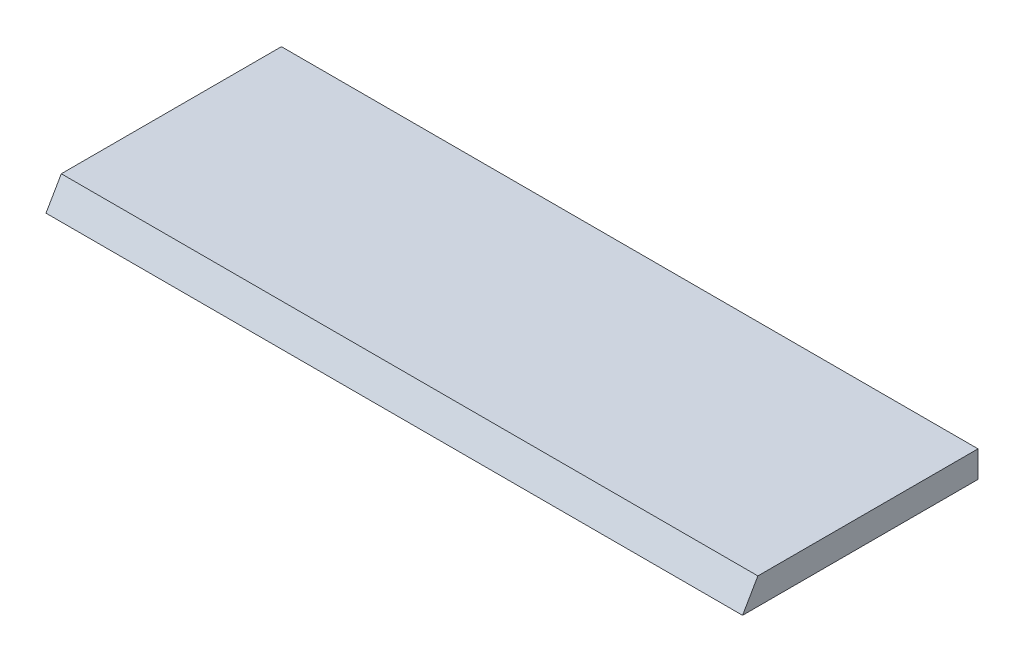
ISO-10303-21;
HEADER;
FILE_DESCRIPTION(('STEP AP214'),'2;1');
FILE_NAME('part.step','',(''),(''),'','','');
FILE_SCHEMA(('AUTOMOTIVE_DESIGN { 1 0 10303 214 1 1 1 1 }'));
ENDSEC;
DATA;
#1=APPLICATION_CONTEXT('core data for automotive mechanical design processes');
#2=APPLICATION_PROTOCOL_DEFINITION('international standard','automotive_design',2000,#1);
#3=PRODUCT_CONTEXT('',#1,'mechanical');
#4=PRODUCT('Part','Part','',(#3));
#5=PRODUCT_RELATED_PRODUCT_CATEGORY('part','',(#4));
#6=PRODUCT_DEFINITION_FORMATION('','',#4);
#7=PRODUCT_DEFINITION_CONTEXT('part definition',#1,'design');
#8=PRODUCT_DEFINITION('design','',#6,#7);
#9=PRODUCT_DEFINITION_SHAPE('','',#8);
#10=(LENGTH_UNIT() NAMED_UNIT(*) SI_UNIT(.MILLI.,.METRE.));
#11=(NAMED_UNIT(*) PLANE_ANGLE_UNIT() SI_UNIT($,.RADIAN.));
#12=(NAMED_UNIT(*) SI_UNIT($,.STERADIAN.) SOLID_ANGLE_UNIT());
#13=UNCERTAINTY_MEASURE_WITH_UNIT(LENGTH_MEASURE(1.E-05),#10,'distance_accuracy_value','');
#14=(GEOMETRIC_REPRESENTATION_CONTEXT(3) GLOBAL_UNCERTAINTY_ASSIGNED_CONTEXT((#13)) GLOBAL_UNIT_ASSIGNED_CONTEXT((#10,
#11,#12)) REPRESENTATION_CONTEXT('',''));
#15=CARTESIAN_POINT('',(0.,0.,0.));
#16=DIRECTION('',(0.,0.,1.));
#17=DIRECTION('',(1.,0.,0.));
#18=AXIS2_PLACEMENT_3D('',#15,#16,#17);
#19=CARTESIAN_POINT('',(0.,-14.2779963984741,-24.7320670166552));
#20=DIRECTION('',(0.,-0.499971920924447,-0.866041614639342));
#21=DIRECTION('',(0.,0.866041614639342,-0.499971920924447));
#22=AXIS2_PLACEMENT_3D('',#19,#20,#21);
#23=PLANE('',#22);
#24=DIRECTION('',(0.,0.866041614639342,-0.499971920924447));
#25=VECTOR('',#24,1.);
#26=CARTESIAN_POINT('',(7.,-14.2779963984741,-24.7320670166552));
#27=LINE('',#26,#25);
#28=CARTESIAN_POINT('',(7.00000000000001,32.9999853798931,-52.0259787266658));
#29=VERTEX_POINT('',#28);
#30=CARTESIAN_POINT('',(7.,39.9999853798931,-56.0671280055357));
#31=VERTEX_POINT('',#30);
#32=EDGE_CURVE('E40',#29,#31,#27,.T.);
#33=ORIENTED_EDGE('',*,*,#32,.F.);
#34=DIRECTION('',(-1.,0.,0.));
#35=VECTOR('',#34,1.);
#36=CARTESIAN_POINT('',(191.,32.9999853798931,-52.0259787266658));
#37=LINE('',#36,#35);
#38=CARTESIAN_POINT('',(191.,32.9999853798931,-52.0259787266658));
#39=VERTEX_POINT('',#38);
#40=EDGE_CURVE('E11',#39,#29,#37,.T.);
#41=ORIENTED_EDGE('',*,*,#40,.F.);
#42=DIRECTION('',(0.,-0.866041614639342,0.499971920924447));
#43=VECTOR('',#42,1.);
#44=CARTESIAN_POINT('',(191.,-14.2779963984741,-24.7320670166552));
#45=LINE('',#44,#43);
#46=CARTESIAN_POINT('',(191.,39.9999853798931,-56.0671280055357));
#47=VERTEX_POINT('',#46);
#48=EDGE_CURVE('E80',#47,#39,#45,.T.);
#49=ORIENTED_EDGE('',*,*,#48,.F.);
#50=DIRECTION('',(1.,0.,0.));
#51=VECTOR('',#50,1.);
#52=CARTESIAN_POINT('',(198.,39.9999853798931,-56.0671280055357));
#53=LINE('',#52,#51);
#54=EDGE_CURVE('E76',#31,#47,#53,.T.);
#55=ORIENTED_EDGE('',*,*,#54,.F.);
#56=EDGE_LOOP('',(#33,#41,#49,#55));
#57=FACE_BOUND('',#56,.T.);
#58=ADVANCED_FACE('F36',(#57),#23,.F.);
#59=CARTESIAN_POINT('',(7.,0.,0.));
#60=DIRECTION('',(1.,0.,0.));
#61=DIRECTION('',(0.,0.,-1.));
#62=AXIS2_PLACEMENT_3D('',#59,#60,#61);
#63=PLANE('',#62);
#64=DIRECTION('',(0.,0.999999634497327,-0.000854988428673071));
#65=VECTOR('',#64,1.);
#66=CARTESIAN_POINT('',(7.,-0.097622540917072,-114.179913975305));
#67=LINE('',#66,#65);
#68=CARTESIAN_POINT('',(7.,32.9999853798931,-114.208212057437));
#69=VERTEX_POINT('',#68);
#70=CARTESIAN_POINT('',(7.00000000000001,39.9999853798931,-114.214196978625));
#71=VERTEX_POINT('',#70);
#72=EDGE_CURVE('E93',#69,#71,#67,.T.);
#73=ORIENTED_EDGE('',*,*,#72,.F.);
#74=DIRECTION('',(0.,0.,1.));
#75=VECTOR('',#74,1.);
#76=CARTESIAN_POINT('',(7.00000000000001,32.9999853798931,-45.2007372036753));
#77=LINE('',#76,#75);
#78=EDGE_CURVE('E56',#69,#29,#77,.T.);
#79=ORIENTED_EDGE('',*,*,#78,.T.);
#80=ORIENTED_EDGE('',*,*,#32,.T.);
#81=DIRECTION('',(0.,0.,1.));
#82=VECTOR('',#81,1.);
#83=CARTESIAN_POINT('',(7.00000000000001,39.9999853798931,-45.2007372036753));
#84=LINE('',#83,#82);
#85=EDGE_CURVE('E83',#71,#31,#84,.T.);
#86=ORIENTED_EDGE('',*,*,#85,.F.);
#87=EDGE_LOOP('',(#73,#79,#80,#86));
#88=FACE_BOUND('',#87,.T.);
#89=ADVANCED_FACE('F92',(#88),#63,.F.);
#90=CARTESIAN_POINT('',(191.,0.,0.));
#91=DIRECTION('',(-1.,0.,0.));
#92=DIRECTION('',(0.,0.,1.));
#93=AXIS2_PLACEMENT_3D('',#90,#91,#92);
#94=PLANE('',#93);
#95=ORIENTED_EDGE('',*,*,#48,.T.);
#96=DIRECTION('',(0.,0.,1.));
#97=VECTOR('',#96,1.);
#98=CARTESIAN_POINT('',(191.,32.9999853798931,-45.2007372036753));
#99=LINE('',#98,#97);
#100=CARTESIAN_POINT('',(191.,32.9999853798931,-114.208212057437));
#101=VERTEX_POINT('',#100);
#102=EDGE_CURVE('E45',#101,#39,#99,.T.);
#103=ORIENTED_EDGE('',*,*,#102,.F.);
#104=DIRECTION('',(0.,0.999999634497327,-0.000854988428673071));
#105=VECTOR('',#104,1.);
#106=CARTESIAN_POINT('',(191.,-0.097622540917072,-114.179913975305));
#107=LINE('',#106,#105);
#108=CARTESIAN_POINT('',(191.,39.9999853798931,-114.214196978625));
#109=VERTEX_POINT('',#108);
#110=EDGE_CURVE('E94',#101,#109,#107,.T.);
#111=ORIENTED_EDGE('',*,*,#110,.T.);
#112=DIRECTION('',(0.,0.,-1.));
#113=VECTOR('',#112,1.);
#114=CARTESIAN_POINT('',(191.,39.9999853798931,-45.2007372036753));
#115=LINE('',#114,#113);
#116=EDGE_CURVE('E104',#47,#109,#115,.T.);
#117=ORIENTED_EDGE('',*,*,#116,.F.);
#118=EDGE_LOOP('',(#95,#103,#111,#117));
#119=FACE_BOUND('',#118,.T.);
#120=ADVANCED_FACE('F109',(#119),#94,.F.);
#121=CARTESIAN_POINT('',(0.,-0.097622540917072,-114.179913975305));
#122=DIRECTION('',(0.,0.000854988428673071,0.999999634497327));
#123=DIRECTION('',(0.,-0.999999634497327,0.000854988428673071));
#124=AXIS2_PLACEMENT_3D('',#121,#122,#123);
#125=PLANE('',#124);
#126=ORIENTED_EDGE('',*,*,#110,.F.);
#127=DIRECTION('',(-1.,0.,0.));
#128=VECTOR('',#127,1.);
#129=CARTESIAN_POINT('',(198.,32.9999853798931,-114.208212057437));
#130=LINE('',#129,#128);
#131=EDGE_CURVE('E84',#101,#69,#130,.T.);
#132=ORIENTED_EDGE('',*,*,#131,.T.);
#133=ORIENTED_EDGE('',*,*,#72,.T.);
#134=DIRECTION('',(-1.,0.,0.));
#135=VECTOR('',#134,1.);
#136=CARTESIAN_POINT('',(198.,39.9999853798931,-114.214196978625));
#137=LINE('',#136,#135);
#138=EDGE_CURVE('E88',#109,#71,#137,.T.);
#139=ORIENTED_EDGE('',*,*,#138,.F.);
#140=EDGE_LOOP('',(#126,#132,#133,#139));
#141=FACE_BOUND('',#140,.T.);
#142=ADVANCED_FACE('F108',(#141),#125,.F.);
#143=CARTESIAN_POINT('',(198.,32.9999853798931,-45.2007372036753));
#144=DIRECTION('',(0.,-1.,0.));
#145=DIRECTION('',(0.,0.,-1.));
#146=AXIS2_PLACEMENT_3D('',#143,#144,#145);
#147=PLANE('',#146);
#148=ORIENTED_EDGE('',*,*,#40,.T.);
#149=ORIENTED_EDGE('',*,*,#78,.F.);
#150=ORIENTED_EDGE('',*,*,#131,.F.);
#151=ORIENTED_EDGE('',*,*,#102,.T.);
#152=EDGE_LOOP('',(#148,#149,#150,#151));
#153=FACE_BOUND('',#152,.T.);
#154=ADVANCED_FACE('F110',(#153),#147,.T.);
#155=CARTESIAN_POINT('',(198.,39.9999853798931,-45.2007372036753));
#156=DIRECTION('',(0.,-1.,0.));
#157=DIRECTION('',(0.,0.,-1.));
#158=AXIS2_PLACEMENT_3D('',#155,#156,#157);
#159=PLANE('',#158);
#160=ORIENTED_EDGE('',*,*,#85,.T.);
#161=ORIENTED_EDGE('',*,*,#54,.T.);
#162=ORIENTED_EDGE('',*,*,#116,.T.);
#163=ORIENTED_EDGE('',*,*,#138,.T.);
#164=EDGE_LOOP('',(#160,#161,#162,#163));
#165=FACE_BOUND('',#164,.T.);
#166=ADVANCED_FACE('F38',(#165),#159,.F.);
#167=CLOSED_SHELL('',(#58,#89,#120,#142,#154,#166));
#168=MANIFOLD_SOLID_BREP('B2',#167);
#169=ADVANCED_BREP_SHAPE_REPRESENTATION('',(#18,#168),#14);
#170=SHAPE_DEFINITION_REPRESENTATION(#9,#169);
ENDSEC;
END-ISO-10303-21;
